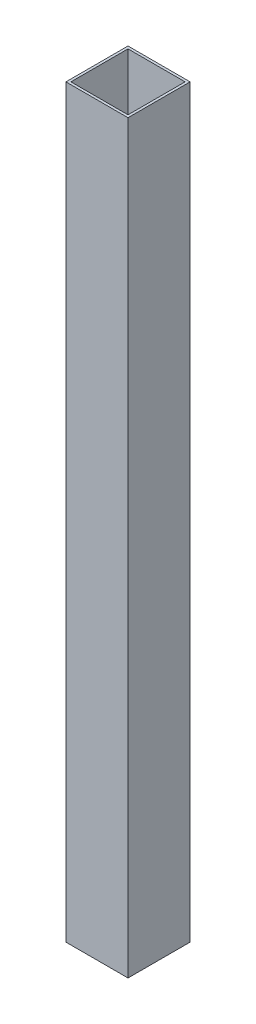
ISO-10303-21;
HEADER;
FILE_DESCRIPTION(('STEP AP214'),'2;1');
FILE_NAME('part.step','',(''),(''),'','','');
FILE_SCHEMA(('AUTOMOTIVE_DESIGN { 1 0 10303 214 1 1 1 1 }'));
ENDSEC;
DATA;
#1=APPLICATION_CONTEXT('core data for automotive mechanical design processes');
#2=APPLICATION_PROTOCOL_DEFINITION('international standard','automotive_design',2000,#1);
#3=PRODUCT_CONTEXT('',#1,'mechanical');
#4=PRODUCT('Part','Part','',(#3));
#5=PRODUCT_RELATED_PRODUCT_CATEGORY('part','',(#4));
#6=PRODUCT_DEFINITION_FORMATION('','',#4);
#7=PRODUCT_DEFINITION_CONTEXT('part definition',#1,'design');
#8=PRODUCT_DEFINITION('design','',#6,#7);
#9=PRODUCT_DEFINITION_SHAPE('','',#8);
#10=(LENGTH_UNIT() NAMED_UNIT(*) SI_UNIT(.MILLI.,.METRE.));
#11=(NAMED_UNIT(*) PLANE_ANGLE_UNIT() SI_UNIT($,.RADIAN.));
#12=(NAMED_UNIT(*) SI_UNIT($,.STERADIAN.) SOLID_ANGLE_UNIT());
#13=UNCERTAINTY_MEASURE_WITH_UNIT(LENGTH_MEASURE(1.E-05),#10,'distance_accuracy_value','');
#14=(GEOMETRIC_REPRESENTATION_CONTEXT(3) GLOBAL_UNCERTAINTY_ASSIGNED_CONTEXT((#13)) GLOBAL_UNIT_ASSIGNED_CONTEXT((#10,
#11,#12)) REPRESENTATION_CONTEXT('',''));
#15=CARTESIAN_POINT('',(0.,0.,0.));
#16=DIRECTION('',(0.,0.,1.));
#17=DIRECTION('',(1.,0.,0.));
#18=AXIS2_PLACEMENT_3D('',#15,#16,#17);
#19=CARTESIAN_POINT('',(0.,600.,0.));
#20=DIRECTION('',(0.,-1.,0.));
#21=DIRECTION('',(0.,0.,-1.));
#22=AXIS2_PLACEMENT_3D('',#19,#20,#21);
#23=PLANE('',#22);
#24=DIRECTION('',(0.,0.,-1.));
#25=VECTOR('',#24,1.);
#26=CARTESIAN_POINT('',(25.,600.,25.));
#27=LINE('',#26,#25);
#28=CARTESIAN_POINT('',(25.,600.,25.));
#29=VERTEX_POINT('',#28);
#30=CARTESIAN_POINT('',(25.,600.,-25.));
#31=VERTEX_POINT('',#30);
#32=EDGE_CURVE('E153',#29,#31,#27,.T.);
#33=ORIENTED_EDGE('',*,*,#32,.T.);
#34=DIRECTION('',(-1.,0.,0.));
#35=VECTOR('',#34,1.);
#36=CARTESIAN_POINT('',(-25.,600.,-25.));
#37=LINE('',#36,#35);
#38=CARTESIAN_POINT('',(-25.,600.,-25.));
#39=VERTEX_POINT('',#38);
#40=EDGE_CURVE('E157',#31,#39,#37,.T.);
#41=ORIENTED_EDGE('',*,*,#40,.T.);
#42=DIRECTION('',(0.,0.,1.));
#43=VECTOR('',#42,1.);
#44=CARTESIAN_POINT('',(-25.,600.,25.));
#45=LINE('',#44,#43);
#46=CARTESIAN_POINT('',(-25.,600.,25.));
#47=VERTEX_POINT('',#46);
#48=EDGE_CURVE('E161',#39,#47,#45,.T.);
#49=ORIENTED_EDGE('',*,*,#48,.T.);
#50=DIRECTION('',(1.,0.,0.));
#51=VECTOR('',#50,1.);
#52=CARTESIAN_POINT('',(-25.,600.,25.));
#53=LINE('',#52,#51);
#54=EDGE_CURVE('E164',#47,#29,#53,.T.);
#55=ORIENTED_EDGE('',*,*,#54,.T.);
#56=EDGE_LOOP('',(#33,#41,#49,#55));
#57=FACE_BOUND('',#56,.T.);
#58=DIRECTION('',(0.,0.,1.));
#59=VECTOR('',#58,1.);
#60=CARTESIAN_POINT('',(-23.,600.,23.));
#61=LINE('',#60,#59);
#62=CARTESIAN_POINT('',(-23.,600.,-23.));
#63=VERTEX_POINT('',#62);
#64=CARTESIAN_POINT('',(-23.,600.,23.));
#65=VERTEX_POINT('',#64);
#66=EDGE_CURVE('E105',#63,#65,#61,.T.);
#67=ORIENTED_EDGE('',*,*,#66,.F.);
#68=DIRECTION('',(-1.,0.,0.));
#69=VECTOR('',#68,1.);
#70=CARTESIAN_POINT('',(-23.,600.,-23.));
#71=LINE('',#70,#69);
#72=CARTESIAN_POINT('',(23.,600.,-23.));
#73=VERTEX_POINT('',#72);
#74=EDGE_CURVE('E131',#73,#63,#71,.T.);
#75=ORIENTED_EDGE('',*,*,#74,.F.);
#76=DIRECTION('',(0.,0.,-1.));
#77=VECTOR('',#76,1.);
#78=CARTESIAN_POINT('',(23.,600.,23.));
#79=LINE('',#78,#77);
#80=CARTESIAN_POINT('',(23.,600.,23.));
#81=VERTEX_POINT('',#80);
#82=EDGE_CURVE('E127',#81,#73,#79,.T.);
#83=ORIENTED_EDGE('',*,*,#82,.F.);
#84=DIRECTION('',(1.,0.,0.));
#85=VECTOR('',#84,1.);
#86=CARTESIAN_POINT('',(-23.,600.,23.));
#87=LINE('',#86,#85);
#88=EDGE_CURVE('E114',#65,#81,#87,.T.);
#89=ORIENTED_EDGE('',*,*,#88,.F.);
#90=EDGE_LOOP('',(#67,#75,#83,#89));
#91=FACE_BOUND('',#90,.T.);
#92=ADVANCED_FACE('F39',(#57,#91),#23,.F.);
#93=CARTESIAN_POINT('',(0.,0.,0.));
#94=DIRECTION('',(0.,-1.,0.));
#95=DIRECTION('',(0.,0.,-1.));
#96=AXIS2_PLACEMENT_3D('',#93,#94,#95);
#97=PLANE('',#96);
#98=DIRECTION('',(0.,0.,-1.));
#99=VECTOR('',#98,1.);
#100=CARTESIAN_POINT('',(25.,0.,25.));
#101=LINE('',#100,#99);
#102=CARTESIAN_POINT('',(25.,0.,25.));
#103=VERTEX_POINT('',#102);
#104=CARTESIAN_POINT('',(25.,0.,-25.));
#105=VERTEX_POINT('',#104);
#106=EDGE_CURVE('E123',#103,#105,#101,.T.);
#107=ORIENTED_EDGE('',*,*,#106,.F.);
#108=DIRECTION('',(1.,0.,0.));
#109=VECTOR('',#108,1.);
#110=CARTESIAN_POINT('',(-25.,0.,25.));
#111=LINE('',#110,#109);
#112=CARTESIAN_POINT('',(-25.,0.,25.));
#113=VERTEX_POINT('',#112);
#114=EDGE_CURVE('E158',#113,#103,#111,.T.);
#115=ORIENTED_EDGE('',*,*,#114,.F.);
#116=DIRECTION('',(0.,0.,1.));
#117=VECTOR('',#116,1.);
#118=CARTESIAN_POINT('',(-25.,0.,25.));
#119=LINE('',#118,#117);
#120=CARTESIAN_POINT('',(-25.,0.,-25.));
#121=VERTEX_POINT('',#120);
#122=EDGE_CURVE('E174',#121,#113,#119,.T.);
#123=ORIENTED_EDGE('',*,*,#122,.F.);
#124=DIRECTION('',(-1.,0.,0.));
#125=VECTOR('',#124,1.);
#126=CARTESIAN_POINT('',(-25.,0.,-25.));
#127=LINE('',#126,#125);
#128=EDGE_CURVE('E171',#105,#121,#127,.T.);
#129=ORIENTED_EDGE('',*,*,#128,.F.);
#130=EDGE_LOOP('',(#107,#115,#123,#129));
#131=FACE_BOUND('',#130,.T.);
#132=DIRECTION('',(-1.,0.,0.));
#133=VECTOR('',#132,1.);
#134=CARTESIAN_POINT('',(-23.,0.,-23.));
#135=LINE('',#134,#133);
#136=CARTESIAN_POINT('',(23.,0.,-23.));
#137=VERTEX_POINT('',#136);
#138=CARTESIAN_POINT('',(-23.,0.,-23.));
#139=VERTEX_POINT('',#138);
#140=EDGE_CURVE('E115',#137,#139,#135,.T.);
#141=ORIENTED_EDGE('',*,*,#140,.T.);
#142=DIRECTION('',(0.,0.,1.));
#143=VECTOR('',#142,1.);
#144=CARTESIAN_POINT('',(-23.,0.,23.));
#145=LINE('',#144,#143);
#146=CARTESIAN_POINT('',(-23.,0.,23.));
#147=VERTEX_POINT('',#146);
#148=EDGE_CURVE('E63',#139,#147,#145,.T.);
#149=ORIENTED_EDGE('',*,*,#148,.T.);
#150=DIRECTION('',(1.,0.,0.));
#151=VECTOR('',#150,1.);
#152=CARTESIAN_POINT('',(-23.,0.,23.));
#153=LINE('',#152,#151);
#154=CARTESIAN_POINT('',(23.,0.,23.));
#155=VERTEX_POINT('',#154);
#156=EDGE_CURVE('E121',#147,#155,#153,.T.);
#157=ORIENTED_EDGE('',*,*,#156,.T.);
#158=DIRECTION('',(0.,0.,-1.));
#159=VECTOR('',#158,1.);
#160=CARTESIAN_POINT('',(23.,0.,23.));
#161=LINE('',#160,#159);
#162=EDGE_CURVE('E140',#155,#137,#161,.T.);
#163=ORIENTED_EDGE('',*,*,#162,.T.);
#164=EDGE_LOOP('',(#141,#149,#157,#163));
#165=FACE_BOUND('',#164,.T.);
#166=ADVANCED_FACE('F197',(#131,#165),#97,.T.);
#167=CARTESIAN_POINT('',(25.,600.,25.));
#168=DIRECTION('',(-1.,0.,0.));
#169=DIRECTION('',(0.,0.,1.));
#170=AXIS2_PLACEMENT_3D('',#167,#168,#169);
#171=PLANE('',#170);
#172=ORIENTED_EDGE('',*,*,#106,.T.);
#173=DIRECTION('',(0.,-1.,0.));
#174=VECTOR('',#173,1.);
#175=CARTESIAN_POINT('',(25.,600.,-25.));
#176=LINE('',#175,#174);
#177=EDGE_CURVE('E11',#31,#105,#176,.T.);
#178=ORIENTED_EDGE('',*,*,#177,.F.);
#179=ORIENTED_EDGE('',*,*,#32,.F.);
#180=DIRECTION('',(0.,-1.,0.));
#181=VECTOR('',#180,1.);
#182=CARTESIAN_POINT('',(25.,600.,25.));
#183=LINE('',#182,#181);
#184=EDGE_CURVE('E167',#29,#103,#183,.T.);
#185=ORIENTED_EDGE('',*,*,#184,.T.);
#186=EDGE_LOOP('',(#172,#178,#179,#185));
#187=FACE_BOUND('',#186,.T.);
#188=ADVANCED_FACE('F41',(#187),#171,.F.);
#189=CARTESIAN_POINT('',(-25.,600.,-25.));
#190=DIRECTION('',(0.,0.,1.));
#191=DIRECTION('',(1.,0.,0.));
#192=AXIS2_PLACEMENT_3D('',#189,#190,#191);
#193=PLANE('',#192);
#194=ORIENTED_EDGE('',*,*,#128,.T.);
#195=DIRECTION('',(0.,-1.,0.));
#196=VECTOR('',#195,1.);
#197=CARTESIAN_POINT('',(-25.,600.,-25.));
#198=LINE('',#197,#196);
#199=EDGE_CURVE('E48',#39,#121,#198,.T.);
#200=ORIENTED_EDGE('',*,*,#199,.F.);
#201=ORIENTED_EDGE('',*,*,#40,.F.);
#202=ORIENTED_EDGE('',*,*,#177,.T.);
#203=EDGE_LOOP('',(#194,#200,#201,#202));
#204=FACE_BOUND('',#203,.T.);
#205=ADVANCED_FACE('F207',(#204),#193,.F.);
#206=CARTESIAN_POINT('',(-25.,600.,25.));
#207=DIRECTION('',(1.,0.,0.));
#208=DIRECTION('',(0.,0.,-1.));
#209=AXIS2_PLACEMENT_3D('',#206,#207,#208);
#210=PLANE('',#209);
#211=ORIENTED_EDGE('',*,*,#122,.T.);
#212=DIRECTION('',(0.,-1.,0.));
#213=VECTOR('',#212,1.);
#214=CARTESIAN_POINT('',(-25.,600.,25.));
#215=LINE('',#214,#213);
#216=EDGE_CURVE('E182',#47,#113,#215,.T.);
#217=ORIENTED_EDGE('',*,*,#216,.F.);
#218=ORIENTED_EDGE('',*,*,#48,.F.);
#219=ORIENTED_EDGE('',*,*,#199,.T.);
#220=EDGE_LOOP('',(#211,#217,#218,#219));
#221=FACE_BOUND('',#220,.T.);
#222=ADVANCED_FACE('F191',(#221),#210,.F.);
#223=CARTESIAN_POINT('',(-25.,600.,25.));
#224=DIRECTION('',(0.,0.,-1.));
#225=DIRECTION('',(-1.,0.,0.));
#226=AXIS2_PLACEMENT_3D('',#223,#224,#225);
#227=PLANE('',#226);
#228=ORIENTED_EDGE('',*,*,#114,.T.);
#229=ORIENTED_EDGE('',*,*,#184,.F.);
#230=ORIENTED_EDGE('',*,*,#54,.F.);
#231=ORIENTED_EDGE('',*,*,#216,.T.);
#232=EDGE_LOOP('',(#228,#229,#230,#231));
#233=FACE_BOUND('',#232,.T.);
#234=ADVANCED_FACE('F201',(#233),#227,.F.);
#235=CARTESIAN_POINT('',(-23.,600.,23.));
#236=DIRECTION('',(1.,0.,0.));
#237=DIRECTION('',(0.,0.,-1.));
#238=AXIS2_PLACEMENT_3D('',#235,#236,#237);
#239=PLANE('',#238);
#240=ORIENTED_EDGE('',*,*,#148,.F.);
#241=DIRECTION('',(0.,-1.,0.));
#242=VECTOR('',#241,1.);
#243=CARTESIAN_POINT('',(-23.,600.,-23.));
#244=LINE('',#243,#242);
#245=EDGE_CURVE('E109',#63,#139,#244,.T.);
#246=ORIENTED_EDGE('',*,*,#245,.F.);
#247=ORIENTED_EDGE('',*,*,#66,.T.);
#248=DIRECTION('',(0.,-1.,0.));
#249=VECTOR('',#248,1.);
#250=CARTESIAN_POINT('',(-23.,600.,23.));
#251=LINE('',#250,#249);
#252=EDGE_CURVE('E108',#65,#147,#251,.T.);
#253=ORIENTED_EDGE('',*,*,#252,.T.);
#254=EDGE_LOOP('',(#240,#246,#247,#253));
#255=FACE_BOUND('',#254,.T.);
#256=ADVANCED_FACE('F107',(#255),#239,.T.);
#257=CARTESIAN_POINT('',(-23.,600.,23.));
#258=DIRECTION('',(0.,0.,-1.));
#259=DIRECTION('',(-1.,0.,0.));
#260=AXIS2_PLACEMENT_3D('',#257,#258,#259);
#261=PLANE('',#260);
#262=ORIENTED_EDGE('',*,*,#156,.F.);
#263=ORIENTED_EDGE('',*,*,#252,.F.);
#264=ORIENTED_EDGE('',*,*,#88,.T.);
#265=DIRECTION('',(0.,-1.,0.));
#266=VECTOR('',#265,1.);
#267=CARTESIAN_POINT('',(23.,600.,23.));
#268=LINE('',#267,#266);
#269=EDGE_CURVE('E124',#81,#155,#268,.T.);
#270=ORIENTED_EDGE('',*,*,#269,.T.);
#271=EDGE_LOOP('',(#262,#263,#264,#270));
#272=FACE_BOUND('',#271,.T.);
#273=ADVANCED_FACE('F118',(#272),#261,.T.);
#274=CARTESIAN_POINT('',(23.,600.,23.));
#275=DIRECTION('',(-1.,0.,0.));
#276=DIRECTION('',(0.,0.,1.));
#277=AXIS2_PLACEMENT_3D('',#274,#275,#276);
#278=PLANE('',#277);
#279=ORIENTED_EDGE('',*,*,#162,.F.);
#280=ORIENTED_EDGE('',*,*,#269,.F.);
#281=ORIENTED_EDGE('',*,*,#82,.T.);
#282=DIRECTION('',(0.,-1.,0.));
#283=VECTOR('',#282,1.);
#284=CARTESIAN_POINT('',(23.,600.,-23.));
#285=LINE('',#284,#283);
#286=EDGE_CURVE('E55',#73,#137,#285,.T.);
#287=ORIENTED_EDGE('',*,*,#286,.T.);
#288=EDGE_LOOP('',(#279,#280,#281,#287));
#289=FACE_BOUND('',#288,.T.);
#290=ADVANCED_FACE('F230',(#289),#278,.T.);
#291=CARTESIAN_POINT('',(-23.,600.,-23.));
#292=DIRECTION('',(0.,0.,1.));
#293=DIRECTION('',(1.,0.,0.));
#294=AXIS2_PLACEMENT_3D('',#291,#292,#293);
#295=PLANE('',#294);
#296=ORIENTED_EDGE('',*,*,#140,.F.);
#297=ORIENTED_EDGE('',*,*,#286,.F.);
#298=ORIENTED_EDGE('',*,*,#74,.T.);
#299=ORIENTED_EDGE('',*,*,#245,.T.);
#300=EDGE_LOOP('',(#296,#297,#298,#299));
#301=FACE_BOUND('',#300,.T.);
#302=ADVANCED_FACE('F234',(#301),#295,.T.);
#303=CLOSED_SHELL('',(#92,#166,#188,#205,#222,#234,#256,#273,#290,#302));
#304=MANIFOLD_SOLID_BREP('B2',#303);
#305=ADVANCED_BREP_SHAPE_REPRESENTATION('',(#18,#304),#14);
#306=SHAPE_DEFINITION_REPRESENTATION(#9,#305);
ENDSEC;
END-ISO-10303-21;
